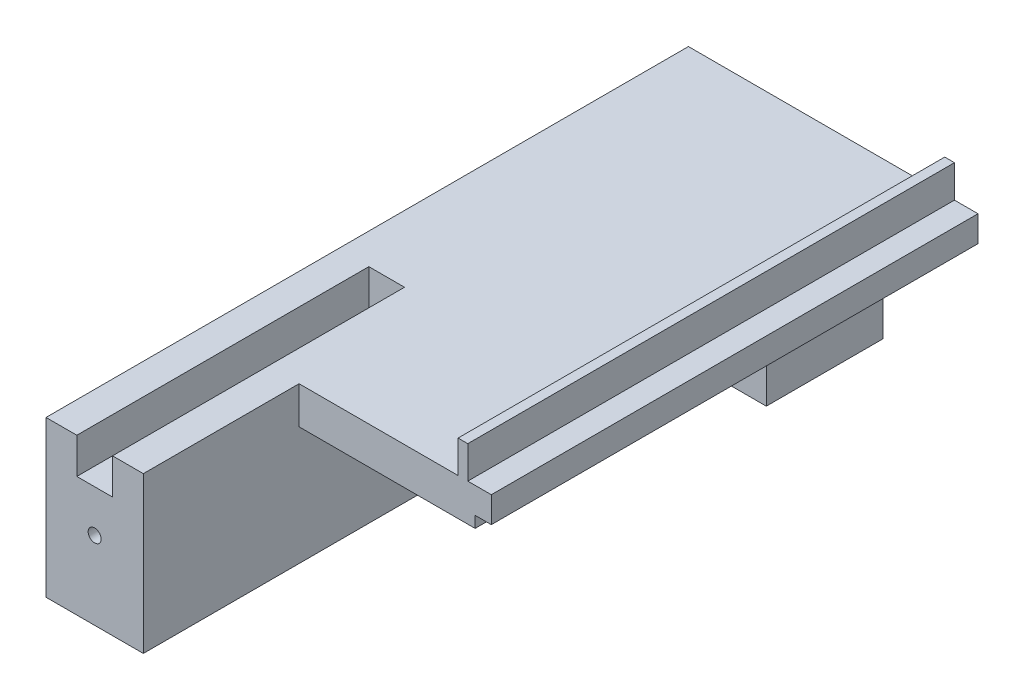
ISO-10303-21;
HEADER;
FILE_DESCRIPTION(('STEP AP214'),'2;1');
FILE_NAME('part.step','',(''),(''),'','','');
FILE_SCHEMA(('AUTOMOTIVE_DESIGN { 1 0 10303 214 1 1 1 1 }'));
ENDSEC;
DATA;
#1=APPLICATION_CONTEXT('core data for automotive mechanical design processes');
#2=APPLICATION_PROTOCOL_DEFINITION('international standard','automotive_design',2000,#1);
#3=PRODUCT_CONTEXT('',#1,'mechanical');
#4=PRODUCT('Part','Part','',(#3));
#5=PRODUCT_RELATED_PRODUCT_CATEGORY('part','',(#4));
#6=PRODUCT_DEFINITION_FORMATION('','',#4);
#7=PRODUCT_DEFINITION_CONTEXT('part definition',#1,'design');
#8=PRODUCT_DEFINITION('design','',#6,#7);
#9=PRODUCT_DEFINITION_SHAPE('','',#8);
#10=(LENGTH_UNIT() NAMED_UNIT(*) SI_UNIT(.MILLI.,.METRE.));
#11=(NAMED_UNIT(*) PLANE_ANGLE_UNIT() SI_UNIT($,.RADIAN.));
#12=(NAMED_UNIT(*) SI_UNIT($,.STERADIAN.) SOLID_ANGLE_UNIT());
#13=UNCERTAINTY_MEASURE_WITH_UNIT(LENGTH_MEASURE(1.E-05),#10,'distance_accuracy_value','');
#14=(GEOMETRIC_REPRESENTATION_CONTEXT(3) GLOBAL_UNCERTAINTY_ASSIGNED_CONTEXT((#13)) GLOBAL_UNIT_ASSIGNED_CONTEXT((#10,
#11,#12)) REPRESENTATION_CONTEXT('',''));
#15=CARTESIAN_POINT('',(0.,0.,0.));
#16=DIRECTION('',(0.,0.,1.));
#17=DIRECTION('',(1.,0.,0.));
#18=AXIS2_PLACEMENT_3D('',#15,#16,#17);
#19=CARTESIAN_POINT('',(-66.2162162162162,31.0112612612613,-6.));
#20=DIRECTION('',(0.,-1.,0.));
#21=DIRECTION('',(0.,0.,1.));
#22=AXIS2_PLACEMENT_3D('',#19,#20,#21);
#23=PLANE('',#22);
#24=DIRECTION('',(0.,0.,-1.));
#25=VECTOR('',#24,1.);
#26=CARTESIAN_POINT('',(-45.7162162162162,31.0112612612613,162.000012));
#27=LINE('',#26,#25);
#28=CARTESIAN_POINT('',(-45.7162162162162,31.0112612612613,162.));
#29=VERTEX_POINT('',#28);
#30=CARTESIAN_POINT('',(-45.7162162162162,31.0112612612613,72.));
#31=VERTEX_POINT('',#30);
#32=EDGE_CURVE('E211',#29,#31,#27,.T.);
#33=ORIENTED_EDGE('',*,*,#32,.F.);
#34=DIRECTION('',(1.,0.,0.));
#35=VECTOR('',#34,1.);
#36=CARTESIAN_POINT('',(-66.2162162162162,31.0112612612613,162.));
#37=LINE('',#36,#35);
#38=CARTESIAN_POINT('',(-36.2162162162162,31.0112612612613,162.));
#39=VERTEX_POINT('',#38);
#40=EDGE_CURVE('E288',#29,#39,#37,.T.);
#41=ORIENTED_EDGE('',*,*,#40,.T.);
#42=DIRECTION('',(0.,0.,-1.));
#43=VECTOR('',#42,1.);
#44=CARTESIAN_POINT('',(-36.2162162162162,31.0112612612613,162.));
#45=LINE('',#44,#43);
#46=CARTESIAN_POINT('',(-36.2162162162162,31.0112612612613,114.));
#47=VERTEX_POINT('',#46);
#48=EDGE_CURVE('E302',#39,#47,#45,.T.);
#49=ORIENTED_EDGE('',*,*,#48,.T.);
#50=DIRECTION('',(-1.,0.,0.));
#51=VECTOR('',#50,1.);
#52=CARTESIAN_POINT('',(23.0337837837838,31.0112612612613,114.));
#53=LINE('',#52,#51);
#54=CARTESIAN_POINT('',(12.7837837837838,31.0112612612613,114.));
#55=VERTEX_POINT('',#54);
#56=EDGE_CURVE('E267',#55,#47,#53,.T.);
#57=ORIENTED_EDGE('',*,*,#56,.F.);
#58=DIRECTION('',(0.,0.,-1.));
#59=VECTOR('',#58,1.);
#60=CARTESIAN_POINT('',(12.7837837837838,31.0112612612613,114.));
#61=LINE('',#60,#59);
#62=CARTESIAN_POINT('',(12.7837837837838,31.0112612612613,-36.));
#63=VERTEX_POINT('',#62);
#64=EDGE_CURVE('E238',#55,#63,#61,.T.);
#65=ORIENTED_EDGE('',*,*,#64,.T.);
#66=DIRECTION('',(-1.,0.,0.));
#67=VECTOR('',#66,1.);
#68=CARTESIAN_POINT('',(-66.2162162162162,31.0112612612613,-36.));
#69=LINE('',#68,#67);
#70=CARTESIAN_POINT('',(-66.2162162162162,31.0112612612613,-36.));
#71=VERTEX_POINT('',#70);
#72=EDGE_CURVE('E328',#63,#71,#69,.T.);
#73=ORIENTED_EDGE('',*,*,#72,.T.);
#74=DIRECTION('',(0.,0.,1.));
#75=VECTOR('',#74,1.);
#76=CARTESIAN_POINT('',(-66.2162162162162,31.0112612612613,-6.));
#77=LINE('',#76,#75);
#78=CARTESIAN_POINT('',(-66.2162162162162,31.0112612612613,162.));
#79=VERTEX_POINT('',#78);
#80=EDGE_CURVE('E364',#71,#79,#77,.T.);
#81=ORIENTED_EDGE('',*,*,#80,.T.);
#82=CARTESIAN_POINT('',(-56.7162162162162,31.0112612612613,162.));
#83=VERTEX_POINT('',#82);
#84=EDGE_CURVE('E289',#79,#83,#37,.T.);
#85=ORIENTED_EDGE('',*,*,#84,.T.);
#86=DIRECTION('',(0.,0.,-1.));
#87=VECTOR('',#86,1.);
#88=CARTESIAN_POINT('',(-56.7162162162162,31.0112612612613,162.000012));
#89=LINE('',#88,#87);
#90=CARTESIAN_POINT('',(-56.7162162162162,31.0112612612613,72.));
#91=VERTEX_POINT('',#90);
#92=EDGE_CURVE('E218',#83,#91,#89,.T.);
#93=ORIENTED_EDGE('',*,*,#92,.T.);
#94=DIRECTION('',(1.,0.,0.));
#95=VECTOR('',#94,1.);
#96=CARTESIAN_POINT('',(-56.7162162162162,31.0112612612613,72.));
#97=LINE('',#96,#95);
#98=EDGE_CURVE('E215',#91,#31,#97,.T.);
#99=ORIENTED_EDGE('',*,*,#98,.T.);
#100=EDGE_LOOP('',(#33,#41,#49,#57,#65,#73,#81,#85,#93,#99));
#101=FACE_BOUND('',#100,.T.);
#102=ADVANCED_FACE('F43',(#101),#23,.F.);
#103=CARTESIAN_POINT('',(0.,0.,162.));
#104=DIRECTION('',(0.,0.,-1.));
#105=DIRECTION('',(1.,0.,0.));
#106=AXIS2_PLACEMENT_3D('',#103,#104,#105);
#107=PLANE('',#106);
#108=CARTESIAN_POINT('',(-51.2162162162162,7.01126126126126,162.));
#109=DIRECTION('',(0.,0.,-1.));
#110=DIRECTION('',(-1.,0.,0.));
#111=AXIS2_PLACEMENT_3D('',#108,#109,#110);
#112=CIRCLE('',#111,2.);
#113=CARTESIAN_POINT('',(-53.2162162162162,7.01126126126126,162.));
#114=VERTEX_POINT('',#113);
#115=EDGE_CURVE('E279',#114,#114,#112,.T.);
#116=ORIENTED_EDGE('',*,*,#115,.T.);
#117=EDGE_LOOP('',(#116));
#118=FACE_BOUND('',#117,.T.);
#119=DIRECTION('',(0.,-1.,0.));
#120=VECTOR('',#119,1.);
#121=CARTESIAN_POINT('',(-45.7162162162162,0.,162.));
#122=LINE('',#121,#120);
#123=CARTESIAN_POINT('',(-45.7162162162162,20.0112612612613,162.));
#124=VERTEX_POINT('',#123);
#125=EDGE_CURVE('E11',#29,#124,#122,.T.);
#126=ORIENTED_EDGE('',*,*,#125,.T.);
#127=DIRECTION('',(-1.,0.,0.));
#128=VECTOR('',#127,1.);
#129=CARTESIAN_POINT('',(0.,20.0112612612613,162.));
#130=LINE('',#129,#128);
#131=CARTESIAN_POINT('',(-56.7162162162162,20.0112612612613,162.));
#132=VERTEX_POINT('',#131);
#133=EDGE_CURVE('E51',#124,#132,#130,.T.);
#134=ORIENTED_EDGE('',*,*,#133,.T.);
#135=DIRECTION('',(0.,1.,0.));
#136=VECTOR('',#135,1.);
#137=CARTESIAN_POINT('',(-56.7162162162162,0.,162.));
#138=LINE('',#137,#136);
#139=EDGE_CURVE('E382',#132,#83,#138,.T.);
#140=ORIENTED_EDGE('',*,*,#139,.T.);
#141=ORIENTED_EDGE('',*,*,#84,.F.);
#142=DIRECTION('',(0.,1.,0.));
#143=VECTOR('',#142,1.);
#144=CARTESIAN_POINT('',(-66.2162162162162,31.0112612612613,162.));
#145=LINE('',#144,#143);
#146=CARTESIAN_POINT('',(-66.2162162162162,-16.9887387387387,162.));
#147=VERTEX_POINT('',#146);
#148=EDGE_CURVE('E286',#147,#79,#145,.T.);
#149=ORIENTED_EDGE('',*,*,#148,.F.);
#150=DIRECTION('',(-1.,0.,0.));
#151=VECTOR('',#150,1.);
#152=CARTESIAN_POINT('',(-66.2162162162162,-16.9887387387387,162.));
#153=LINE('',#152,#151);
#154=CARTESIAN_POINT('',(-36.2162162162162,-16.9887387387387,162.));
#155=VERTEX_POINT('',#154);
#156=EDGE_CURVE('E295',#155,#147,#153,.T.);
#157=ORIENTED_EDGE('',*,*,#156,.F.);
#158=DIRECTION('',(0.,-1.,0.));
#159=VECTOR('',#158,1.);
#160=CARTESIAN_POINT('',(-36.2162162162162,31.0112612612613,162.));
#161=LINE('',#160,#159);
#162=EDGE_CURVE('E292',#39,#155,#161,.T.);
#163=ORIENTED_EDGE('',*,*,#162,.F.);
#164=ORIENTED_EDGE('',*,*,#40,.F.);
#165=EDGE_LOOP('',(#126,#134,#140,#141,#149,#157,#163,#164));
#166=FACE_BOUND('',#165,.T.);
#167=ADVANCED_FACE('F384',(#118,#166),#107,.F.);
#168=DIRECTION('',(0.,0.,1.));
#169=VECTOR('',#168,1.);
#170=CARTESIAN_POINT('',(15.7837837837838,31.0112612612613,-36.));
#171=LINE('',#170,#169);
#172=CARTESIAN_POINT('',(15.7837837837838,31.0112612612613,-36.));
#173=VERTEX_POINT('',#172);
#174=CARTESIAN_POINT('',(15.7837837837838,31.0112612612613,114.));
#175=VERTEX_POINT('',#174);
#176=EDGE_CURVE('E231',#173,#175,#171,.T.);
#177=ORIENTED_EDGE('',*,*,#176,.T.);
#178=CARTESIAN_POINT('',(23.0337837837838,31.0112612612613,114.));
#179=VERTEX_POINT('',#178);
#180=EDGE_CURVE('E269',#179,#175,#53,.T.);
#181=ORIENTED_EDGE('',*,*,#180,.F.);
#182=DIRECTION('',(0.,0.,-1.));
#183=VECTOR('',#182,1.);
#184=CARTESIAN_POINT('',(23.0337837837838,31.0112612612613,-36.));
#185=LINE('',#184,#183);
#186=CARTESIAN_POINT('',(23.0337837837838,31.0112612612613,-36.));
#187=VERTEX_POINT('',#186);
#188=EDGE_CURVE('E261',#179,#187,#185,.T.);
#189=ORIENTED_EDGE('',*,*,#188,.T.);
#190=EDGE_CURVE('E324',#187,#173,#69,.T.);
#191=ORIENTED_EDGE('',*,*,#190,.T.);
#192=EDGE_LOOP('',(#177,#181,#189,#191));
#193=FACE_BOUND('',#192,.T.);
#194=ADVANCED_FACE('F404',(#193),#23,.F.);
#195=CARTESIAN_POINT('',(0.,0.,0.));
#196=DIRECTION('',(0.,0.,-1.));
#197=DIRECTION('',(1.,0.,0.));
#198=AXIS2_PLACEMENT_3D('',#195,#196,#197);
#199=PLANE('',#198);
#200=DIRECTION('',(-1.,0.,0.));
#201=VECTOR('',#200,1.);
#202=CARTESIAN_POINT('',(0.,19.5112612612613,0.));
#203=LINE('',#202,#201);
#204=CARTESIAN_POINT('',(-6.21621621621621,19.5112612612613,0.));
#205=VERTEX_POINT('',#204);
#206=CARTESIAN_POINT('',(-36.2162162162162,19.5112612612613,0.));
#207=VERTEX_POINT('',#206);
#208=EDGE_CURVE('E276',#205,#207,#203,.T.);
#209=ORIENTED_EDGE('',*,*,#208,.T.);
#210=DIRECTION('',(0.,-1.,0.));
#211=VECTOR('',#210,1.);
#212=CARTESIAN_POINT('',(-36.2162162162162,31.0112612612613,0.));
#213=LINE('',#212,#211);
#214=CARTESIAN_POINT('',(-36.2162162162162,-16.9887387387387,0.));
#215=VERTEX_POINT('',#214);
#216=EDGE_CURVE('E283',#207,#215,#213,.T.);
#217=ORIENTED_EDGE('',*,*,#216,.T.);
#218=DIRECTION('',(1.,0.,0.));
#219=VECTOR('',#218,1.);
#220=CARTESIAN_POINT('',(-66.2162162162162,-16.9887387387387,0.));
#221=LINE('',#220,#219);
#222=CARTESIAN_POINT('',(-6.2162162162162,-16.9887387387387,0.));
#223=VERTEX_POINT('',#222);
#224=EDGE_CURVE('E340',#215,#223,#221,.T.);
#225=ORIENTED_EDGE('',*,*,#224,.T.);
#226=DIRECTION('',(0.,1.,0.));
#227=VECTOR('',#226,1.);
#228=CARTESIAN_POINT('',(-6.21621621621621,31.0112612612613,0.));
#229=LINE('',#228,#227);
#230=EDGE_CURVE('E361',#223,#205,#229,.T.);
#231=ORIENTED_EDGE('',*,*,#230,.T.);
#232=EDGE_LOOP('',(#209,#217,#225,#231));
#233=FACE_BOUND('',#232,.T.);
#234=ADVANCED_FACE('F413',(#233),#199,.F.);
#235=CARTESIAN_POINT('',(-6.21621621621621,31.0112612612613,-6.));
#236=DIRECTION('',(-1.,0.,0.));
#237=DIRECTION('',(0.,-1.,0.));
#238=AXIS2_PLACEMENT_3D('',#235,#236,#237);
#239=PLANE('',#238);
#240=DIRECTION('',(0.,0.,1.));
#241=VECTOR('',#240,1.);
#242=CARTESIAN_POINT('',(-6.21621621621621,19.5112612612613,-6.));
#243=LINE('',#242,#241);
#244=CARTESIAN_POINT('',(-6.2162162162162,19.5112612612613,-6.));
#245=VERTEX_POINT('',#244);
#246=EDGE_CURVE('E274',#245,#205,#243,.T.);
#247=ORIENTED_EDGE('',*,*,#246,.T.);
#248=ORIENTED_EDGE('',*,*,#230,.F.);
#249=DIRECTION('',(0.,0.,1.));
#250=VECTOR('',#249,1.);
#251=CARTESIAN_POINT('',(-6.2162162162162,-16.9887387387387,-6.));
#252=LINE('',#251,#250);
#253=CARTESIAN_POINT('',(-6.2162162162162,-16.9887387387387,-36.));
#254=VERTEX_POINT('',#253);
#255=EDGE_CURVE('E371',#254,#223,#252,.T.);
#256=ORIENTED_EDGE('',*,*,#255,.F.);
#257=DIRECTION('',(0.,1.,0.));
#258=VECTOR('',#257,1.);
#259=CARTESIAN_POINT('',(-6.2162162162162,-5.48873873873874,-36.));
#260=LINE('',#259,#258);
#261=CARTESIAN_POINT('',(-6.2162162162162,-5.48873873873874,-36.));
#262=VERTEX_POINT('',#261);
#263=EDGE_CURVE('E353',#254,#262,#260,.T.);
#264=ORIENTED_EDGE('',*,*,#263,.T.);
#265=DIRECTION('',(0.,0.,1.));
#266=VECTOR('',#265,1.);
#267=CARTESIAN_POINT('',(-6.2162162162162,-5.48873873873874,-36.));
#268=LINE('',#267,#266);
#269=CARTESIAN_POINT('',(-6.2162162162162,-5.48873873873874,-6.));
#270=VERTEX_POINT('',#269);
#271=EDGE_CURVE('E321',#262,#270,#268,.T.);
#272=ORIENTED_EDGE('',*,*,#271,.T.);
#273=DIRECTION('',(0.,1.,0.));
#274=VECTOR('',#273,1.);
#275=CARTESIAN_POINT('',(-6.21621621621621,31.0112612612613,-6.));
#276=LINE('',#275,#274);
#277=EDGE_CURVE('E360',#270,#245,#276,.T.);
#278=ORIENTED_EDGE('',*,*,#277,.T.);
#279=EDGE_LOOP('',(#247,#248,#256,#264,#272,#278));
#280=FACE_BOUND('',#279,.T.);
#281=ADVANCED_FACE('F418',(#280),#239,.F.);
#282=CARTESIAN_POINT('',(-36.2162162162162,31.0112612612613,162.));
#283=DIRECTION('',(-1.,0.,0.));
#284=DIRECTION('',(0.,-1.,0.));
#285=AXIS2_PLACEMENT_3D('',#282,#283,#284);
#286=PLANE('',#285);
#287=DIRECTION('',(0.,0.,1.));
#288=VECTOR('',#287,1.);
#289=CARTESIAN_POINT('',(-36.2162162162162,19.5112612612613,162.));
#290=LINE('',#289,#288);
#291=CARTESIAN_POINT('',(-36.2162162162162,19.5112612612613,114.));
#292=VERTEX_POINT('',#291);
#293=EDGE_CURVE('E375',#207,#292,#290,.T.);
#294=ORIENTED_EDGE('',*,*,#293,.T.);
#295=DIRECTION('',(0.,1.,0.));
#296=VECTOR('',#295,1.);
#297=CARTESIAN_POINT('',(-36.2162162162162,19.5112612612613,114.));
#298=LINE('',#297,#296);
#299=EDGE_CURVE('E258',#292,#47,#298,.T.);
#300=ORIENTED_EDGE('',*,*,#299,.T.);
#301=ORIENTED_EDGE('',*,*,#48,.F.);
#302=ORIENTED_EDGE('',*,*,#162,.T.);
#303=DIRECTION('',(0.,0.,-1.));
#304=VECTOR('',#303,1.);
#305=CARTESIAN_POINT('',(-36.2162162162162,-16.9887387387387,162.));
#306=LINE('',#305,#304);
#307=EDGE_CURVE('E298',#155,#215,#306,.T.);
#308=ORIENTED_EDGE('',*,*,#307,.T.);
#309=ORIENTED_EDGE('',*,*,#216,.F.);
#310=EDGE_LOOP('',(#294,#300,#301,#302,#308,#309));
#311=FACE_BOUND('',#310,.T.);
#312=ADVANCED_FACE('F452',(#311),#286,.F.);
#313=CARTESIAN_POINT('',(-66.2162162162162,31.0112612612613,-6.));
#314=DIRECTION('',(1.,0.,0.));
#315=DIRECTION('',(0.,0.,1.));
#316=AXIS2_PLACEMENT_3D('',#313,#314,#315);
#317=PLANE('',#316);
#318=ORIENTED_EDGE('',*,*,#80,.F.);
#319=DIRECTION('',(0.,-1.,0.));
#320=VECTOR('',#319,1.);
#321=CARTESIAN_POINT('',(-66.2162162162162,31.0112612612613,-36.));
#322=LINE('',#321,#320);
#323=CARTESIAN_POINT('',(-66.2162162162162,19.5112612612613,-36.));
#324=VERTEX_POINT('',#323);
#325=EDGE_CURVE('E327',#71,#324,#322,.T.);
#326=ORIENTED_EDGE('',*,*,#325,.T.);
#327=DIRECTION('',(0.,0.,1.));
#328=VECTOR('',#327,1.);
#329=CARTESIAN_POINT('',(-66.2162162162162,19.5112612612613,-36.));
#330=LINE('',#329,#328);
#331=CARTESIAN_POINT('',(-66.2162162162162,19.5112612612613,-6.));
#332=VERTEX_POINT('',#331);
#333=EDGE_CURVE('E334',#324,#332,#330,.T.);
#334=ORIENTED_EDGE('',*,*,#333,.T.);
#335=DIRECTION('',(0.,-1.,0.));
#336=VECTOR('',#335,1.);
#337=CARTESIAN_POINT('',(-66.2162162162162,31.0112612612613,-6.));
#338=LINE('',#337,#336);
#339=CARTESIAN_POINT('',(-66.2162162162162,-5.48873873873874,-6.));
#340=VERTEX_POINT('',#339);
#341=EDGE_CURVE('E357',#332,#340,#338,.T.);
#342=ORIENTED_EDGE('',*,*,#341,.T.);
#343=DIRECTION('',(0.,0.,1.));
#344=VECTOR('',#343,1.);
#345=CARTESIAN_POINT('',(-66.2162162162162,-5.48873873873874,-36.));
#346=LINE('',#345,#344);
#347=CARTESIAN_POINT('',(-66.2162162162162,-5.48873873873874,-36.));
#348=VERTEX_POINT('',#347);
#349=EDGE_CURVE('E343',#348,#340,#346,.T.);
#350=ORIENTED_EDGE('',*,*,#349,.F.);
#351=DIRECTION('',(0.,-1.,0.));
#352=VECTOR('',#351,1.);
#353=CARTESIAN_POINT('',(-66.2162162162162,-5.48873873873874,-36.));
#354=LINE('',#353,#352);
#355=CARTESIAN_POINT('',(-66.2162162162162,-16.9887387387387,-36.));
#356=VERTEX_POINT('',#355);
#357=EDGE_CURVE('E346',#348,#356,#354,.T.);
#358=ORIENTED_EDGE('',*,*,#357,.T.);
#359=DIRECTION('',(0.,0.,1.));
#360=VECTOR('',#359,1.);
#361=CARTESIAN_POINT('',(-66.2162162162162,-16.9887387387387,-6.));
#362=LINE('',#361,#360);
#363=EDGE_CURVE('E373',#356,#147,#362,.T.);
#364=ORIENTED_EDGE('',*,*,#363,.T.);
#365=ORIENTED_EDGE('',*,*,#148,.T.);
#366=EDGE_LOOP('',(#318,#326,#334,#342,#350,#358,#364,#365));
#367=FACE_BOUND('',#366,.T.);
#368=ADVANCED_FACE('F45',(#367),#317,.F.);
#369=CARTESIAN_POINT('',(-66.2162162162162,-16.9887387387387,-6.));
#370=DIRECTION('',(0.,1.,0.));
#371=DIRECTION('',(0.,0.,-1.));
#372=AXIS2_PLACEMENT_3D('',#369,#370,#371);
#373=PLANE('',#372);
#374=ORIENTED_EDGE('',*,*,#363,.F.);
#375=DIRECTION('',(1.,0.,0.));
#376=VECTOR('',#375,1.);
#377=CARTESIAN_POINT('',(-6.2162162162162,-16.9887387387387,-36.));
#378=LINE('',#377,#376);
#379=EDGE_CURVE('E348',#356,#254,#378,.T.);
#380=ORIENTED_EDGE('',*,*,#379,.T.);
#381=ORIENTED_EDGE('',*,*,#255,.T.);
#382=ORIENTED_EDGE('',*,*,#224,.F.);
#383=ORIENTED_EDGE('',*,*,#307,.F.);
#384=ORIENTED_EDGE('',*,*,#156,.T.);
#385=EDGE_LOOP('',(#374,#380,#381,#382,#383,#384));
#386=FACE_BOUND('',#385,.T.);
#387=ADVANCED_FACE('F528',(#386),#373,.F.);
#388=CARTESIAN_POINT('',(0.,0.,-6.));
#389=DIRECTION('',(0.,0.,-1.));
#390=DIRECTION('',(1.,0.,0.));
#391=AXIS2_PLACEMENT_3D('',#388,#389,#390);
#392=PLANE('',#391);
#393=DIRECTION('',(1.,0.,0.));
#394=VECTOR('',#393,1.);
#395=CARTESIAN_POINT('',(-6.2162162162162,19.5112612612613,-6.));
#396=LINE('',#395,#394);
#397=EDGE_CURVE('E335',#332,#245,#396,.T.);
#398=ORIENTED_EDGE('',*,*,#397,.T.);
#399=ORIENTED_EDGE('',*,*,#277,.F.);
#400=DIRECTION('',(-1.,0.,0.));
#401=VECTOR('',#400,1.);
#402=CARTESIAN_POINT('',(-66.2162162162162,-5.48873873873874,-6.));
#403=LINE('',#402,#401);
#404=EDGE_CURVE('E337',#270,#340,#403,.T.);
#405=ORIENTED_EDGE('',*,*,#404,.T.);
#406=ORIENTED_EDGE('',*,*,#341,.F.);
#407=EDGE_LOOP('',(#398,#399,#405,#406));
#408=FACE_BOUND('',#407,.T.);
#409=ADVANCED_FACE('F522',(#408),#392,.T.);
#410=CARTESIAN_POINT('',(-66.2162162162162,-5.48873873873874,-36.));
#411=DIRECTION('',(0.,-1.,0.));
#412=DIRECTION('',(0.,0.,1.));
#413=AXIS2_PLACEMENT_3D('',#410,#411,#412);
#414=PLANE('',#413);
#415=ORIENTED_EDGE('',*,*,#404,.F.);
#416=ORIENTED_EDGE('',*,*,#271,.F.);
#417=DIRECTION('',(-1.,0.,0.));
#418=VECTOR('',#417,1.);
#419=CARTESIAN_POINT('',(-66.2162162162162,-5.48873873873874,-36.));
#420=LINE('',#419,#418);
#421=EDGE_CURVE('E351',#262,#348,#420,.T.);
#422=ORIENTED_EDGE('',*,*,#421,.T.);
#423=ORIENTED_EDGE('',*,*,#349,.T.);
#424=EDGE_LOOP('',(#415,#416,#422,#423));
#425=FACE_BOUND('',#424,.T.);
#426=ADVANCED_FACE('F519',(#425),#414,.F.);
#427=CARTESIAN_POINT('',(0.,0.,-36.));
#428=DIRECTION('',(0.,0.,-1.));
#429=DIRECTION('',(1.,0.,0.));
#430=AXIS2_PLACEMENT_3D('',#427,#428,#429);
#431=PLANE('',#430);
#432=CARTESIAN_POINT('',(-51.2162162162162,-11.6387387387387,-36.));
#433=DIRECTION('',(0.,0.,1.));
#434=DIRECTION('',(1.,0.,0.));
#435=AXIS2_PLACEMENT_3D('',#432,#433,#434);
#436=CIRCLE('',#435,2.);
#437=CARTESIAN_POINT('',(-49.2162162162162,-11.6387387387387,-36.));
#438=VERTEX_POINT('',#437);
#439=EDGE_CURVE('E313',#438,#438,#436,.T.);
#440=ORIENTED_EDGE('',*,*,#439,.T.);
#441=EDGE_LOOP('',(#440));
#442=FACE_BOUND('',#441,.T.);
#443=CARTESIAN_POINT('',(-12.2162162162162,-11.6387387387387,-36.));
#444=DIRECTION('',(0.,0.,1.));
#445=DIRECTION('',(1.,0.,0.));
#446=AXIS2_PLACEMENT_3D('',#443,#444,#445);
#447=CIRCLE('',#446,2.);
#448=CARTESIAN_POINT('',(-10.2162162162162,-11.6387387387387,-36.));
#449=VERTEX_POINT('',#448);
#450=EDGE_CURVE('E306',#449,#449,#447,.T.);
#451=ORIENTED_EDGE('',*,*,#450,.T.);
#452=EDGE_LOOP('',(#451));
#453=FACE_BOUND('',#452,.T.);
#454=ORIENTED_EDGE('',*,*,#379,.F.);
#455=ORIENTED_EDGE('',*,*,#357,.F.);
#456=ORIENTED_EDGE('',*,*,#421,.F.);
#457=ORIENTED_EDGE('',*,*,#263,.F.);
#458=EDGE_LOOP('',(#454,#455,#456,#457));
#459=FACE_BOUND('',#458,.T.);
#460=ADVANCED_FACE('F518',(#442,#453,#459),#431,.T.);
#461=CARTESIAN_POINT('',(-6.2162162162162,19.5112612612613,-36.));
#462=DIRECTION('',(0.,1.,0.));
#463=DIRECTION('',(-1.,0.,0.));
#464=AXIS2_PLACEMENT_3D('',#461,#462,#463);
#465=PLANE('',#464);
#466=DIRECTION('',(-1.,0.,0.));
#467=VECTOR('',#466,1.);
#468=CARTESIAN_POINT('',(23.0337837837838,19.5112612612613,114.));
#469=LINE('',#468,#467);
#470=CARTESIAN_POINT('',(18.0337837837838,19.5112612612613,114.));
#471=VERTEX_POINT('',#470);
#472=EDGE_CURVE('E272',#471,#292,#469,.T.);
#473=ORIENTED_EDGE('',*,*,#472,.T.);
#474=ORIENTED_EDGE('',*,*,#293,.F.);
#475=ORIENTED_EDGE('',*,*,#208,.F.);
#476=ORIENTED_EDGE('',*,*,#246,.F.);
#477=ORIENTED_EDGE('',*,*,#397,.F.);
#478=ORIENTED_EDGE('',*,*,#333,.F.);
#479=DIRECTION('',(1.,0.,0.));
#480=VECTOR('',#479,1.);
#481=CARTESIAN_POINT('',(-6.2162162162162,19.5112612612613,-36.));
#482=LINE('',#481,#480);
#483=CARTESIAN_POINT('',(18.0337837837838,19.5112612612613,-36.));
#484=VERTEX_POINT('',#483);
#485=EDGE_CURVE('E331',#324,#484,#482,.T.);
#486=ORIENTED_EDGE('',*,*,#485,.T.);
#487=DIRECTION('',(0.,0.,1.));
#488=VECTOR('',#487,1.);
#489=CARTESIAN_POINT('',(18.0337837837838,19.5112612612613,-36.));
#490=LINE('',#489,#488);
#491=EDGE_CURVE('E227',#484,#471,#490,.T.);
#492=ORIENTED_EDGE('',*,*,#491,.T.);
#493=EDGE_LOOP('',(#473,#474,#475,#476,#477,#478,#486,#492));
#494=FACE_BOUND('',#493,.T.);
#495=ADVANCED_FACE('F456',(#494),#465,.F.);
#496=CARTESIAN_POINT('',(0.,0.,-36.));
#497=DIRECTION('',(0.,0.,1.));
#498=DIRECTION('',(-1.,0.,0.));
#499=AXIS2_PLACEMENT_3D('',#496,#497,#498);
#500=PLANE('',#499);
#501=DIRECTION('',(0.,1.,0.));
#502=VECTOR('',#501,1.);
#503=CARTESIAN_POINT('',(18.0337837837838,23.0112612612612,-36.));
#504=LINE('',#503,#502);
#505=CARTESIAN_POINT('',(18.0337837837838,23.0112612612612,-36.));
#506=VERTEX_POINT('',#505);
#507=EDGE_CURVE('E206',#484,#506,#504,.T.);
#508=ORIENTED_EDGE('',*,*,#507,.F.);
#509=ORIENTED_EDGE('',*,*,#485,.F.);
#510=ORIENTED_EDGE('',*,*,#325,.F.);
#511=ORIENTED_EDGE('',*,*,#72,.F.);
#512=DIRECTION('',(0.,-1.,0.));
#513=VECTOR('',#512,1.);
#514=CARTESIAN_POINT('',(12.7837837837838,41.0112612612613,-36.));
#515=LINE('',#514,#513);
#516=CARTESIAN_POINT('',(12.7837837837838,41.0112612612613,-36.));
#517=VERTEX_POINT('',#516);
#518=EDGE_CURVE('E252',#517,#63,#515,.T.);
#519=ORIENTED_EDGE('',*,*,#518,.F.);
#520=DIRECTION('',(1.,0.,0.));
#521=VECTOR('',#520,1.);
#522=CARTESIAN_POINT('',(15.7837837837838,41.0112612612613,-36.));
#523=LINE('',#522,#521);
#524=CARTESIAN_POINT('',(15.7837837837838,41.0112612612613,-36.));
#525=VERTEX_POINT('',#524);
#526=EDGE_CURVE('E243',#517,#525,#523,.T.);
#527=ORIENTED_EDGE('',*,*,#526,.T.);
#528=DIRECTION('',(0.,-1.,0.));
#529=VECTOR('',#528,1.);
#530=CARTESIAN_POINT('',(15.7837837837838,41.0112612612613,-36.));
#531=LINE('',#530,#529);
#532=EDGE_CURVE('E246',#525,#173,#531,.T.);
#533=ORIENTED_EDGE('',*,*,#532,.T.);
#534=ORIENTED_EDGE('',*,*,#190,.F.);
#535=DIRECTION('',(0.,-1.,0.));
#536=VECTOR('',#535,1.);
#537=CARTESIAN_POINT('',(23.0337837837838,19.5112612612613,-36.));
#538=LINE('',#537,#536);
#539=CARTESIAN_POINT('',(23.0337837837838,23.0112612612613,-36.));
#540=VERTEX_POINT('',#539);
#541=EDGE_CURVE('E264',#187,#540,#538,.T.);
#542=ORIENTED_EDGE('',*,*,#541,.T.);
#543=DIRECTION('',(1.,0.,0.));
#544=VECTOR('',#543,1.);
#545=CARTESIAN_POINT('',(23.0337837837838,23.0112612612613,-36.));
#546=LINE('',#545,#544);
#547=EDGE_CURVE('E224',#506,#540,#546,.T.);
#548=ORIENTED_EDGE('',*,*,#547,.F.);
#549=EDGE_LOOP('',(#508,#509,#510,#511,#519,#527,#533,#534,#542,#548));
#550=FACE_BOUND('',#549,.T.);
#551=CARTESIAN_POINT('',(-51.2162162162162,25.6612612612613,-36.));
#552=DIRECTION('',(0.,0.,1.));
#553=DIRECTION('',(1.,0.,0.));
#554=AXIS2_PLACEMENT_3D('',#551,#552,#553);
#555=CIRCLE('',#554,2.);
#556=CARTESIAN_POINT('',(-49.2162162162162,25.6612612612613,-36.));
#557=VERTEX_POINT('',#556);
#558=EDGE_CURVE('E309',#557,#557,#555,.T.);
#559=ORIENTED_EDGE('',*,*,#558,.T.);
#560=EDGE_LOOP('',(#559));
#561=FACE_BOUND('',#560,.T.);
#562=ADVANCED_FACE('F436',(#550,#561),#500,.F.);
#563=CARTESIAN_POINT('',(-51.2162162162162,25.6612612612613,-20.));
#564=DIRECTION('',(0.,0.,-1.));
#565=DIRECTION('',(1.,0.,0.));
#566=AXIS2_PLACEMENT_3D('',#563,#564,#565);
#567=CYLINDRICAL_SURFACE('',#566,2.);
#568=CARTESIAN_POINT('',(-51.2162162162162,25.6612612612613,-20.));
#569=DIRECTION('',(0.,0.,1.));
#570=DIRECTION('',(1.,0.,0.));
#571=AXIS2_PLACEMENT_3D('',#568,#569,#570);
#572=CIRCLE('',#571,2.);
#573=CARTESIAN_POINT('',(-49.2162162162162,25.6612612612613,-20.));
#574=VERTEX_POINT('',#573);
#575=EDGE_CURVE('E318',#574,#574,#572,.T.);
#576=ORIENTED_EDGE('',*,*,#575,.T.);
#577=EDGE_LOOP('',(#576));
#578=FACE_BOUND('',#577,.T.);
#579=ORIENTED_EDGE('',*,*,#558,.F.);
#580=EDGE_LOOP('',(#579));
#581=FACE_BOUND('',#580,.T.);
#582=ADVANCED_FACE('F509',(#578,#581),#567,.F.);
#583=CARTESIAN_POINT('',(-51.2162162162162,25.6612612612613,-20.));
#584=DIRECTION('',(0.,0.,-1.));
#585=DIRECTION('',(1.,0.,0.));
#586=AXIS2_PLACEMENT_3D('',#583,#584,#585);
#587=PLANE('',#586);
#588=ORIENTED_EDGE('',*,*,#575,.F.);
#589=EDGE_LOOP('',(#588));
#590=FACE_BOUND('',#589,.T.);
#591=ADVANCED_FACE('F495',(#590),#587,.T.);
#592=CARTESIAN_POINT('',(-12.2162162162162,-11.6387387387387,-20.));
#593=DIRECTION('',(0.,0.,-1.));
#594=DIRECTION('',(1.,0.,0.));
#595=AXIS2_PLACEMENT_3D('',#592,#593,#594);
#596=CYLINDRICAL_SURFACE('',#595,2.);
#597=CARTESIAN_POINT('',(-12.2162162162162,-11.6387387387387,-20.));
#598=DIRECTION('',(0.,0.,1.));
#599=DIRECTION('',(1.,0.,0.));
#600=AXIS2_PLACEMENT_3D('',#597,#598,#599);
#601=CIRCLE('',#600,2.);
#602=CARTESIAN_POINT('',(-10.2162162162162,-11.6387387387387,-20.));
#603=VERTEX_POINT('',#602);
#604=EDGE_CURVE('E310',#603,#603,#601,.T.);
#605=ORIENTED_EDGE('',*,*,#604,.T.);
#606=EDGE_LOOP('',(#605));
#607=FACE_BOUND('',#606,.T.);
#608=ORIENTED_EDGE('',*,*,#450,.F.);
#609=EDGE_LOOP('',(#608));
#610=FACE_BOUND('',#609,.T.);
#611=ADVANCED_FACE('F491',(#607,#610),#596,.F.);
#612=CARTESIAN_POINT('',(-12.2162162162162,-11.6387387387387,-20.));
#613=DIRECTION('',(0.,0.,-1.));
#614=DIRECTION('',(1.,0.,0.));
#615=AXIS2_PLACEMENT_3D('',#612,#613,#614);
#616=PLANE('',#615);
#617=ORIENTED_EDGE('',*,*,#604,.F.);
#618=EDGE_LOOP('',(#617));
#619=FACE_BOUND('',#618,.T.);
#620=ADVANCED_FACE('F494',(#619),#616,.T.);
#621=CARTESIAN_POINT('',(-51.2162162162162,-11.6387387387387,-20.));
#622=DIRECTION('',(0.,0.,-1.));
#623=DIRECTION('',(1.,0.,0.));
#624=AXIS2_PLACEMENT_3D('',#621,#622,#623);
#625=CYLINDRICAL_SURFACE('',#624,2.);
#626=CARTESIAN_POINT('',(-51.2162162162162,-11.6387387387387,-20.));
#627=DIRECTION('',(0.,0.,1.));
#628=DIRECTION('',(1.,0.,0.));
#629=AXIS2_PLACEMENT_3D('',#626,#627,#628);
#630=CIRCLE('',#629,2.);
#631=CARTESIAN_POINT('',(-49.2162162162162,-11.6387387387387,-20.));
#632=VERTEX_POINT('',#631);
#633=EDGE_CURVE('E305',#632,#632,#630,.T.);
#634=ORIENTED_EDGE('',*,*,#633,.T.);
#635=EDGE_LOOP('',(#634));
#636=FACE_BOUND('',#635,.T.);
#637=ORIENTED_EDGE('',*,*,#439,.F.);
#638=EDGE_LOOP('',(#637));
#639=FACE_BOUND('',#638,.T.);
#640=ADVANCED_FACE('F499',(#636,#639),#625,.F.);
#641=CARTESIAN_POINT('',(-51.2162162162162,-11.6387387387387,-20.));
#642=DIRECTION('',(0.,0.,-1.));
#643=DIRECTION('',(1.,0.,0.));
#644=AXIS2_PLACEMENT_3D('',#641,#642,#643);
#645=PLANE('',#644);
#646=ORIENTED_EDGE('',*,*,#633,.F.);
#647=EDGE_LOOP('',(#646));
#648=FACE_BOUND('',#647,.T.);
#649=ADVANCED_FACE('F486',(#648),#645,.T.);
#650=CARTESIAN_POINT('',(-51.2162162162162,7.01126126126126,146.));
#651=DIRECTION('',(0.,0.,1.));
#652=DIRECTION('',(-1.,0.,0.));
#653=AXIS2_PLACEMENT_3D('',#650,#651,#652);
#654=CYLINDRICAL_SURFACE('',#653,2.);
#655=CARTESIAN_POINT('',(-51.2162162162162,7.01126126126126,146.));
#656=DIRECTION('',(0.,0.,-1.));
#657=DIRECTION('',(-1.,0.,0.));
#658=AXIS2_PLACEMENT_3D('',#655,#656,#657);
#659=CIRCLE('',#658,2.);
#660=CARTESIAN_POINT('',(-53.2162162162162,7.01126126126126,146.));
#661=VERTEX_POINT('',#660);
#662=EDGE_CURVE('E280',#661,#661,#659,.T.);
#663=ORIENTED_EDGE('',*,*,#662,.T.);
#664=EDGE_LOOP('',(#663));
#665=FACE_BOUND('',#664,.T.);
#666=ORIENTED_EDGE('',*,*,#115,.F.);
#667=EDGE_LOOP('',(#666));
#668=FACE_BOUND('',#667,.T.);
#669=ADVANCED_FACE('F483',(#665,#668),#654,.F.);
#670=CARTESIAN_POINT('',(-51.2162162162162,7.01126126126126,146.));
#671=DIRECTION('',(0.,0.,1.));
#672=DIRECTION('',(-1.,0.,0.));
#673=AXIS2_PLACEMENT_3D('',#670,#671,#672);
#674=PLANE('',#673);
#675=ORIENTED_EDGE('',*,*,#662,.F.);
#676=EDGE_LOOP('',(#675));
#677=FACE_BOUND('',#676,.T.);
#678=ADVANCED_FACE('F478',(#677),#674,.T.);
#679=CARTESIAN_POINT('',(23.0337837837838,0.,0.));
#680=DIRECTION('',(1.,0.,0.));
#681=DIRECTION('',(0.,1.,0.));
#682=AXIS2_PLACEMENT_3D('',#679,#680,#681);
#683=PLANE('',#682);
#684=DIRECTION('',(0.,0.,1.));
#685=VECTOR('',#684,1.);
#686=CARTESIAN_POINT('',(23.0337837837838,23.0112612612613,-36.));
#687=LINE('',#686,#685);
#688=CARTESIAN_POINT('',(23.0337837837838,23.0112612612613,114.));
#689=VERTEX_POINT('',#688);
#690=EDGE_CURVE('E228',#540,#689,#687,.T.);
#691=ORIENTED_EDGE('',*,*,#690,.F.);
#692=ORIENTED_EDGE('',*,*,#541,.F.);
#693=ORIENTED_EDGE('',*,*,#188,.F.);
#694=DIRECTION('',(0.,1.,0.));
#695=VECTOR('',#694,1.);
#696=CARTESIAN_POINT('',(23.0337837837838,19.5112612612613,114.));
#697=LINE('',#696,#695);
#698=EDGE_CURVE('E259',#689,#179,#697,.T.);
#699=ORIENTED_EDGE('',*,*,#698,.F.);
#700=EDGE_LOOP('',(#691,#692,#693,#699));
#701=FACE_BOUND('',#700,.T.);
#702=ADVANCED_FACE('F433',(#701),#683,.T.);
#703=CARTESIAN_POINT('',(23.0337837837838,19.5112612612613,114.));
#704=DIRECTION('',(0.,0.,-1.));
#705=DIRECTION('',(1.,0.,0.));
#706=AXIS2_PLACEMENT_3D('',#703,#704,#705);
#707=PLANE('',#706);
#708=ORIENTED_EDGE('',*,*,#698,.T.);
#709=ORIENTED_EDGE('',*,*,#180,.T.);
#710=DIRECTION('',(0.,-1.,0.));
#711=VECTOR('',#710,1.);
#712=CARTESIAN_POINT('',(15.7837837837838,41.0112612612613,114.));
#713=LINE('',#712,#711);
#714=CARTESIAN_POINT('',(15.7837837837838,41.0112612612613,114.));
#715=VERTEX_POINT('',#714);
#716=EDGE_CURVE('E256',#715,#175,#713,.T.);
#717=ORIENTED_EDGE('',*,*,#716,.F.);
#718=DIRECTION('',(-1.,0.,0.));
#719=VECTOR('',#718,1.);
#720=CARTESIAN_POINT('',(15.7837837837838,41.0112612612613,114.));
#721=LINE('',#720,#719);
#722=CARTESIAN_POINT('',(12.7837837837838,41.0112612612613,114.));
#723=VERTEX_POINT('',#722);
#724=EDGE_CURVE('E237',#715,#723,#721,.T.);
#725=ORIENTED_EDGE('',*,*,#724,.T.);
#726=DIRECTION('',(0.,-1.,0.));
#727=VECTOR('',#726,1.);
#728=CARTESIAN_POINT('',(12.7837837837838,41.0112612612613,114.));
#729=LINE('',#728,#727);
#730=EDGE_CURVE('E254',#723,#55,#729,.T.);
#731=ORIENTED_EDGE('',*,*,#730,.T.);
#732=ORIENTED_EDGE('',*,*,#56,.T.);
#733=ORIENTED_EDGE('',*,*,#299,.F.);
#734=ORIENTED_EDGE('',*,*,#472,.F.);
#735=DIRECTION('',(0.,-1.,0.));
#736=VECTOR('',#735,1.);
#737=CARTESIAN_POINT('',(18.0337837837838,19.5112612612613,114.));
#738=LINE('',#737,#736);
#739=CARTESIAN_POINT('',(18.0337837837838,23.0112612612612,114.));
#740=VERTEX_POINT('',#739);
#741=EDGE_CURVE('E66',#740,#471,#738,.T.);
#742=ORIENTED_EDGE('',*,*,#741,.F.);
#743=DIRECTION('',(-1.,0.,0.));
#744=VECTOR('',#743,1.);
#745=CARTESIAN_POINT('',(23.0337837837838,23.0112612612613,114.));
#746=LINE('',#745,#744);
#747=EDGE_CURVE('E379',#689,#740,#746,.T.);
#748=ORIENTED_EDGE('',*,*,#747,.F.);
#749=EDGE_LOOP('',(#708,#709,#717,#725,#731,#732,#733,#734,#742,#748));
#750=FACE_BOUND('',#749,.T.);
#751=ADVANCED_FACE('F429',(#750),#707,.F.);
#752=CARTESIAN_POINT('',(15.7837837837838,41.0112612612613,-36.));
#753=DIRECTION('',(-1.,0.,0.));
#754=DIRECTION('',(0.,0.,-1.));
#755=AXIS2_PLACEMENT_3D('',#752,#753,#754);
#756=PLANE('',#755);
#757=ORIENTED_EDGE('',*,*,#176,.F.);
#758=ORIENTED_EDGE('',*,*,#532,.F.);
#759=DIRECTION('',(0.,0.,1.));
#760=VECTOR('',#759,1.);
#761=CARTESIAN_POINT('',(15.7837837837838,41.0112612612613,-36.));
#762=LINE('',#761,#760);
#763=EDGE_CURVE('E235',#525,#715,#762,.T.);
#764=ORIENTED_EDGE('',*,*,#763,.T.);
#765=ORIENTED_EDGE('',*,*,#716,.T.);
#766=EDGE_LOOP('',(#757,#758,#764,#765));
#767=FACE_BOUND('',#766,.T.);
#768=ADVANCED_FACE('F425',(#767),#756,.F.);
#769=CARTESIAN_POINT('',(12.7837837837838,41.0112612612613,114.));
#770=DIRECTION('',(1.,0.,0.));
#771=DIRECTION('',(0.,0.,1.));
#772=AXIS2_PLACEMENT_3D('',#769,#770,#771);
#773=PLANE('',#772);
#774=ORIENTED_EDGE('',*,*,#64,.F.);
#775=ORIENTED_EDGE('',*,*,#730,.F.);
#776=DIRECTION('',(0.,0.,-1.));
#777=VECTOR('',#776,1.);
#778=CARTESIAN_POINT('',(12.7837837837838,41.0112612612613,114.));
#779=LINE('',#778,#777);
#780=EDGE_CURVE('E241',#723,#517,#779,.T.);
#781=ORIENTED_EDGE('',*,*,#780,.T.);
#782=ORIENTED_EDGE('',*,*,#518,.T.);
#783=EDGE_LOOP('',(#774,#775,#781,#782));
#784=FACE_BOUND('',#783,.T.);
#785=ADVANCED_FACE('F449',(#784),#773,.F.);
#786=CARTESIAN_POINT('',(0.,41.0112612612613,0.));
#787=DIRECTION('',(0.,1.,0.));
#788=DIRECTION('',(0.,0.,-1.));
#789=AXIS2_PLACEMENT_3D('',#786,#787,#788);
#790=PLANE('',#789);
#791=ORIENTED_EDGE('',*,*,#763,.F.);
#792=ORIENTED_EDGE('',*,*,#526,.F.);
#793=ORIENTED_EDGE('',*,*,#780,.F.);
#794=ORIENTED_EDGE('',*,*,#724,.F.);
#795=EDGE_LOOP('',(#791,#792,#793,#794));
#796=FACE_BOUND('',#795,.T.);
#797=ADVANCED_FACE('F442',(#796),#790,.T.);
#798=CARTESIAN_POINT('',(23.0337837837838,23.0112612612613,-36.));
#799=DIRECTION('',(0.,1.,0.));
#800=DIRECTION('',(-1.,0.,0.));
#801=AXIS2_PLACEMENT_3D('',#798,#799,#800);
#802=PLANE('',#801);
#803=ORIENTED_EDGE('',*,*,#690,.T.);
#804=ORIENTED_EDGE('',*,*,#747,.T.);
#805=DIRECTION('',(0.,0.,1.));
#806=VECTOR('',#805,1.);
#807=CARTESIAN_POINT('',(18.0337837837838,23.0112612612612,-36.));
#808=LINE('',#807,#806);
#809=EDGE_CURVE('E232',#506,#740,#808,.T.);
#810=ORIENTED_EDGE('',*,*,#809,.F.);
#811=ORIENTED_EDGE('',*,*,#547,.T.);
#812=EDGE_LOOP('',(#803,#804,#810,#811));
#813=FACE_BOUND('',#812,.T.);
#814=ADVANCED_FACE('F461',(#813),#802,.F.);
#815=CARTESIAN_POINT('',(18.0337837837838,23.0112612612612,-36.));
#816=DIRECTION('',(-1.,0.,0.));
#817=DIRECTION('',(0.,0.,-1.));
#818=AXIS2_PLACEMENT_3D('',#815,#816,#817);
#819=PLANE('',#818);
#820=ORIENTED_EDGE('',*,*,#809,.T.);
#821=ORIENTED_EDGE('',*,*,#741,.T.);
#822=ORIENTED_EDGE('',*,*,#491,.F.);
#823=ORIENTED_EDGE('',*,*,#507,.T.);
#824=EDGE_LOOP('',(#820,#821,#822,#823));
#825=FACE_BOUND('',#824,.T.);
#826=ADVANCED_FACE('F459',(#825),#819,.F.);
#827=CARTESIAN_POINT('',(-45.7162162162162,20.0112612612613,162.000012));
#828=DIRECTION('',(-1.,0.,0.));
#829=DIRECTION('',(0.,0.,-1.));
#830=AXIS2_PLACEMENT_3D('',#827,#828,#829);
#831=PLANE('',#830);
#832=ORIENTED_EDGE('',*,*,#125,.F.);
#833=ORIENTED_EDGE('',*,*,#32,.T.);
#834=DIRECTION('',(0.,-1.,0.));
#835=VECTOR('',#834,1.);
#836=CARTESIAN_POINT('',(-45.7162162162162,20.0112612612613,72.));
#837=LINE('',#836,#835);
#838=CARTESIAN_POINT('',(-45.7162162162162,20.0112612612613,72.));
#839=VERTEX_POINT('',#838);
#840=EDGE_CURVE('E198',#31,#839,#837,.T.);
#841=ORIENTED_EDGE('',*,*,#840,.T.);
#842=DIRECTION('',(0.,0.,-1.));
#843=VECTOR('',#842,1.);
#844=CARTESIAN_POINT('',(-45.7162162162162,20.0112612612613,162.000012));
#845=LINE('',#844,#843);
#846=EDGE_CURVE('E202',#124,#839,#845,.T.);
#847=ORIENTED_EDGE('',*,*,#846,.F.);
#848=EDGE_LOOP('',(#832,#833,#841,#847));
#849=FACE_BOUND('',#848,.T.);
#850=ADVANCED_FACE('F209',(#849),#831,.T.);
#851=CARTESIAN_POINT('',(-56.7162162162162,20.0112612612613,162.000012));
#852=DIRECTION('',(0.,1.,0.));
#853=DIRECTION('',(0.,0.,-1.));
#854=AXIS2_PLACEMENT_3D('',#851,#852,#853);
#855=PLANE('',#854);
#856=ORIENTED_EDGE('',*,*,#133,.F.);
#857=ORIENTED_EDGE('',*,*,#846,.T.);
#858=DIRECTION('',(-1.,0.,0.));
#859=VECTOR('',#858,1.);
#860=CARTESIAN_POINT('',(-56.7162162162162,20.0112612612613,72.));
#861=LINE('',#860,#859);
#862=CARTESIAN_POINT('',(-56.7162162162162,20.0112612612613,72.));
#863=VERTEX_POINT('',#862);
#864=EDGE_CURVE('E193',#839,#863,#861,.T.);
#865=ORIENTED_EDGE('',*,*,#864,.T.);
#866=DIRECTION('',(0.,0.,-1.));
#867=VECTOR('',#866,1.);
#868=CARTESIAN_POINT('',(-56.7162162162162,20.0112612612613,162.000012));
#869=LINE('',#868,#867);
#870=EDGE_CURVE('E58',#132,#863,#869,.T.);
#871=ORIENTED_EDGE('',*,*,#870,.F.);
#872=EDGE_LOOP('',(#856,#857,#865,#871));
#873=FACE_BOUND('',#872,.T.);
#874=ADVANCED_FACE('F203',(#873),#855,.T.);
#875=CARTESIAN_POINT('',(-56.7162162162162,20.0112612612613,162.000012));
#876=DIRECTION('',(1.,0.,0.));
#877=DIRECTION('',(0.,1.,0.));
#878=AXIS2_PLACEMENT_3D('',#875,#876,#877);
#879=PLANE('',#878);
#880=ORIENTED_EDGE('',*,*,#139,.F.);
#881=ORIENTED_EDGE('',*,*,#870,.T.);
#882=DIRECTION('',(0.,1.,0.));
#883=VECTOR('',#882,1.);
#884=CARTESIAN_POINT('',(-56.7162162162162,20.0112612612613,72.));
#885=LINE('',#884,#883);
#886=EDGE_CURVE('E200',#863,#91,#885,.T.);
#887=ORIENTED_EDGE('',*,*,#886,.T.);
#888=ORIENTED_EDGE('',*,*,#92,.F.);
#889=EDGE_LOOP('',(#880,#881,#887,#888));
#890=FACE_BOUND('',#889,.T.);
#891=ADVANCED_FACE('F393',(#890),#879,.T.);
#892=CARTESIAN_POINT('',(0.,0.,72.));
#893=DIRECTION('',(0.,0.,1.));
#894=DIRECTION('',(-1.,0.,0.));
#895=AXIS2_PLACEMENT_3D('',#892,#893,#894);
#896=PLANE('',#895);
#897=ORIENTED_EDGE('',*,*,#840,.F.);
#898=ORIENTED_EDGE('',*,*,#98,.F.);
#899=ORIENTED_EDGE('',*,*,#886,.F.);
#900=ORIENTED_EDGE('',*,*,#864,.F.);
#901=EDGE_LOOP('',(#897,#898,#899,#900));
#902=FACE_BOUND('',#901,.T.);
#903=ADVANCED_FACE('F195',(#902),#896,.T.);
#904=CLOSED_SHELL('',(#102,#167,#194,#234,#281,#312,#368,#387,#409,#426,#460,#495,#562,#582,
#591,#611,#620,#640,#649,#669,#678,#702,#751,#768,#785,#797,#814,#826,#850,#874,#891,#903));
#905=MANIFOLD_SOLID_BREP('B2',#904);
#906=ADVANCED_BREP_SHAPE_REPRESENTATION('',(#18,#905),#14);
#907=SHAPE_DEFINITION_REPRESENTATION(#9,#906);
ENDSEC;
END-ISO-10303-21;
